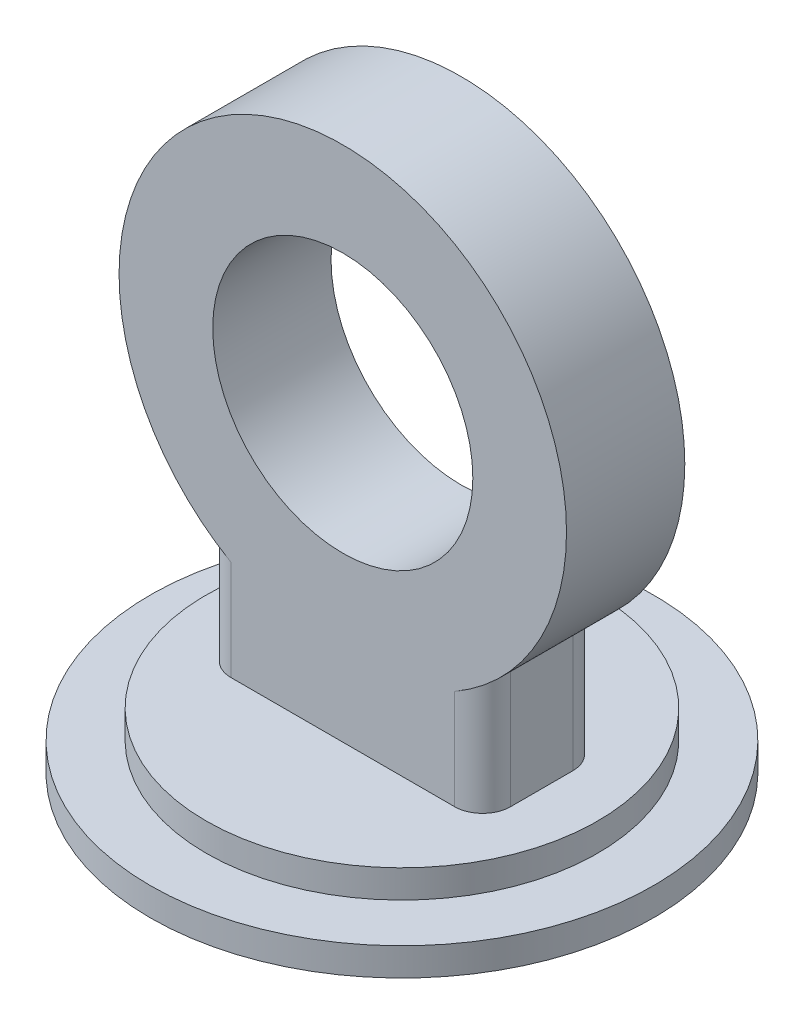
ISO-10303-21;
HEADER;
FILE_DESCRIPTION(('STEP AP214'),'2;1');
FILE_NAME('part.step','',(''),(''),'','','');
FILE_SCHEMA(('AUTOMOTIVE_DESIGN { 1 0 10303 214 1 1 1 1 }'));
ENDSEC;
DATA;
#1=APPLICATION_CONTEXT('core data for automotive mechanical design processes');
#2=APPLICATION_PROTOCOL_DEFINITION('international standard','automotive_design',2000,#1);
#3=PRODUCT_CONTEXT('',#1,'mechanical');
#4=PRODUCT('Part','Part','',(#3));
#5=PRODUCT_RELATED_PRODUCT_CATEGORY('part','',(#4));
#6=PRODUCT_DEFINITION_FORMATION('','',#4);
#7=PRODUCT_DEFINITION_CONTEXT('part definition',#1,'design');
#8=PRODUCT_DEFINITION('design','',#6,#7);
#9=PRODUCT_DEFINITION_SHAPE('','',#8);
#10=(LENGTH_UNIT() NAMED_UNIT(*) SI_UNIT(.MILLI.,.METRE.));
#11=(NAMED_UNIT(*) PLANE_ANGLE_UNIT() SI_UNIT($,.RADIAN.));
#12=(NAMED_UNIT(*) SI_UNIT($,.STERADIAN.) SOLID_ANGLE_UNIT());
#13=UNCERTAINTY_MEASURE_WITH_UNIT(LENGTH_MEASURE(1.E-05),#10,'distance_accuracy_value','');
#14=(GEOMETRIC_REPRESENTATION_CONTEXT(3) GLOBAL_UNCERTAINTY_ASSIGNED_CONTEXT((#13)) GLOBAL_UNIT_ASSIGNED_CONTEXT((#10,
#11,#12)) REPRESENTATION_CONTEXT('',''));
#15=CARTESIAN_POINT('',(0.,0.,0.));
#16=DIRECTION('',(0.,0.,1.));
#17=DIRECTION('',(1.,0.,0.));
#18=AXIS2_PLACEMENT_3D('',#15,#16,#17);
#19=CARTESIAN_POINT('',(0.,10.,0.));
#20=DIRECTION('',(0.,-1.,0.));
#21=DIRECTION('',(0.,0.,-1.));
#22=AXIS2_PLACEMENT_3D('',#19,#20,#21);
#23=CYLINDRICAL_SURFACE('',#22,90.);
#24=CARTESIAN_POINT('',(0.,10.,0.));
#25=DIRECTION('',(0.,1.,0.));
#26=DIRECTION('',(0.,0.,1.));
#27=AXIS2_PLACEMENT_3D('',#24,#25,#26);
#28=CIRCLE('',#27,90.);
#29=CARTESIAN_POINT('',(0.,10.,90.));
#30=VERTEX_POINT('',#29);
#31=EDGE_CURVE('E156',#30,#30,#28,.T.);
#32=ORIENTED_EDGE('',*,*,#31,.F.);
#33=EDGE_LOOP('',(#32));
#34=FACE_BOUND('',#33,.T.);
#35=CARTESIAN_POINT('',(0.,0.,0.));
#36=DIRECTION('',(0.,1.,0.));
#37=DIRECTION('',(0.,0.,1.));
#38=AXIS2_PLACEMENT_3D('',#35,#36,#37);
#39=CIRCLE('',#38,90.);
#40=CARTESIAN_POINT('',(0.,0.,90.));
#41=VERTEX_POINT('',#40);
#42=EDGE_CURVE('E152',#41,#41,#39,.T.);
#43=ORIENTED_EDGE('',*,*,#42,.T.);
#44=EDGE_LOOP('',(#43));
#45=FACE_BOUND('',#44,.T.);
#46=ADVANCED_FACE('F38',(#34,#45),#23,.T.);
#47=CARTESIAN_POINT('',(0.,10.,0.));
#48=DIRECTION('',(0.,1.,0.));
#49=DIRECTION('',(0.,0.,1.));
#50=AXIS2_PLACEMENT_3D('',#47,#48,#49);
#51=PLANE('',#50);
#52=CARTESIAN_POINT('',(0.,10.,0.));
#53=DIRECTION('',(0.,1.,0.));
#54=DIRECTION('',(0.,0.,1.));
#55=AXIS2_PLACEMENT_3D('',#52,#53,#54);
#56=CIRCLE('',#55,70.);
#57=CARTESIAN_POINT('',(0.,10.,70.));
#58=VERTEX_POINT('',#57);
#59=EDGE_CURVE('E153',#58,#58,#56,.T.);
#60=ORIENTED_EDGE('',*,*,#59,.F.);
#61=EDGE_LOOP('',(#60));
#62=FACE_BOUND('',#61,.T.);
#63=ORIENTED_EDGE('',*,*,#31,.T.);
#64=EDGE_LOOP('',(#63));
#65=FACE_BOUND('',#64,.T.);
#66=ADVANCED_FACE('F224',(#62,#65),#51,.T.);
#67=CARTESIAN_POINT('',(0.,0.,0.));
#68=DIRECTION('',(0.,1.,0.));
#69=DIRECTION('',(0.,0.,1.));
#70=AXIS2_PLACEMENT_3D('',#67,#68,#69);
#71=PLANE('',#70);
#72=CARTESIAN_POINT('',(0.,0.,0.));
#73=DIRECTION('',(0.,-1.,0.));
#74=DIRECTION('',(0.,0.,-1.));
#75=AXIS2_PLACEMENT_3D('',#72,#73,#74);
#76=CIRCLE('',#75,46.5);
#77=CARTESIAN_POINT('',(0.,0.,-46.5));
#78=VERTEX_POINT('',#77);
#79=EDGE_CURVE('E276',#78,#78,#76,.T.);
#80=ORIENTED_EDGE('',*,*,#79,.F.);
#81=EDGE_LOOP('',(#80));
#82=FACE_BOUND('',#81,.T.);
#83=ORIENTED_EDGE('',*,*,#42,.F.);
#84=EDGE_LOOP('',(#83));
#85=FACE_BOUND('',#84,.T.);
#86=ADVANCED_FACE('F229',(#82,#85),#71,.F.);
#87=CARTESIAN_POINT('',(0.,20.,0.));
#88=DIRECTION('',(0.,-1.,0.));
#89=DIRECTION('',(0.,0.,-1.));
#90=AXIS2_PLACEMENT_3D('',#87,#88,#89);
#91=CYLINDRICAL_SURFACE('',#90,70.);
#92=CARTESIAN_POINT('',(0.,20.,0.));
#93=DIRECTION('',(0.,1.,0.));
#94=DIRECTION('',(0.,0.,1.));
#95=AXIS2_PLACEMENT_3D('',#92,#93,#94);
#96=CIRCLE('',#95,70.);
#97=CARTESIAN_POINT('',(0.,20.,70.));
#98=VERTEX_POINT('',#97);
#99=EDGE_CURVE('E138',#98,#98,#96,.T.);
#100=ORIENTED_EDGE('',*,*,#99,.F.);
#101=EDGE_LOOP('',(#100));
#102=FACE_BOUND('',#101,.T.);
#103=ORIENTED_EDGE('',*,*,#59,.T.);
#104=EDGE_LOOP('',(#103));
#105=FACE_BOUND('',#104,.T.);
#106=ADVANCED_FACE('F237',(#102,#105),#91,.T.);
#107=CARTESIAN_POINT('',(0.,20.,0.));
#108=DIRECTION('',(0.,1.,0.));
#109=DIRECTION('',(0.,0.,1.));
#110=AXIS2_PLACEMENT_3D('',#107,#108,#109);
#111=PLANE('',#110);
#112=DIRECTION('',(0.,0.,-1.));
#113=VECTOR('',#112,1.);
#114=CARTESIAN_POINT('',(50.,20.,-21.15));
#115=LINE('',#114,#113);
#116=CARTESIAN_POINT('',(50.,20.,11.15));
#117=VERTEX_POINT('',#116);
#118=CARTESIAN_POINT('',(50.,20.,-11.15));
#119=VERTEX_POINT('',#118);
#120=EDGE_CURVE('E135',#117,#119,#115,.T.);
#121=ORIENTED_EDGE('',*,*,#120,.F.);
#122=CARTESIAN_POINT('',(40.,20.,11.15));
#123=DIRECTION('',(0.,1.,0.));
#124=DIRECTION('',(0.,0.,1.));
#125=AXIS2_PLACEMENT_3D('',#122,#123,#124);
#126=CIRCLE('',#125,10.);
#127=CARTESIAN_POINT('',(40.,20.,21.15));
#128=VERTEX_POINT('',#127);
#129=EDGE_CURVE('E66',#117,#128,#126,.F.);
#130=ORIENTED_EDGE('',*,*,#129,.T.);
#131=DIRECTION('',(1.,0.,0.));
#132=VECTOR('',#131,1.);
#133=CARTESIAN_POINT('',(-50.,20.,21.15));
#134=LINE('',#133,#132);
#135=CARTESIAN_POINT('',(-40.,20.,21.15));
#136=VERTEX_POINT('',#135);
#137=EDGE_CURVE('E127',#136,#128,#134,.T.);
#138=ORIENTED_EDGE('',*,*,#137,.F.);
#139=CARTESIAN_POINT('',(-40.,20.,11.15));
#140=DIRECTION('',(0.,1.,0.));
#141=DIRECTION('',(0.,0.,1.));
#142=AXIS2_PLACEMENT_3D('',#139,#140,#141);
#143=CIRCLE('',#142,10.);
#144=CARTESIAN_POINT('',(-50.,20.,11.15));
#145=VERTEX_POINT('',#144);
#146=EDGE_CURVE('E110',#136,#145,#143,.F.);
#147=ORIENTED_EDGE('',*,*,#146,.T.);
#148=DIRECTION('',(0.,0.,1.));
#149=VECTOR('',#148,1.);
#150=CARTESIAN_POINT('',(-50.,20.,-21.15));
#151=LINE('',#150,#149);
#152=CARTESIAN_POINT('',(-50.,20.,-11.15));
#153=VERTEX_POINT('',#152);
#154=EDGE_CURVE('E136',#153,#145,#151,.T.);
#155=ORIENTED_EDGE('',*,*,#154,.F.);
#156=CARTESIAN_POINT('',(-40.,20.,-11.15));
#157=DIRECTION('',(0.,1.,0.));
#158=DIRECTION('',(0.,0.,1.));
#159=AXIS2_PLACEMENT_3D('',#156,#157,#158);
#160=CIRCLE('',#159,10.);
#161=CARTESIAN_POINT('',(-40.,20.,-21.15));
#162=VERTEX_POINT('',#161);
#163=EDGE_CURVE('E180',#153,#162,#160,.F.);
#164=ORIENTED_EDGE('',*,*,#163,.T.);
#165=DIRECTION('',(-1.,0.,0.));
#166=VECTOR('',#165,1.);
#167=CARTESIAN_POINT('',(-50.,20.,-21.15));
#168=LINE('',#167,#166);
#169=CARTESIAN_POINT('',(40.,20.,-21.15));
#170=VERTEX_POINT('',#169);
#171=EDGE_CURVE('E140',#170,#162,#168,.T.);
#172=ORIENTED_EDGE('',*,*,#171,.F.);
#173=CARTESIAN_POINT('',(40.,20.,-11.15));
#174=DIRECTION('',(0.,1.,0.));
#175=DIRECTION('',(0.,0.,1.));
#176=AXIS2_PLACEMENT_3D('',#173,#174,#175);
#177=CIRCLE('',#176,10.);
#178=EDGE_CURVE('E52',#170,#119,#177,.F.);
#179=ORIENTED_EDGE('',*,*,#178,.T.);
#180=EDGE_LOOP('',(#121,#130,#138,#147,#155,#164,#172,#179));
#181=FACE_BOUND('',#180,.T.);
#182=ORIENTED_EDGE('',*,*,#99,.T.);
#183=EDGE_LOOP('',(#182));
#184=FACE_BOUND('',#183,.T.);
#185=ADVANCED_FACE('F133',(#181,#184),#111,.T.);
#186=CARTESIAN_POINT('',(-50.,205.002,-21.15));
#187=DIRECTION('',(0.,0.,1.));
#188=DIRECTION('',(1.,0.,0.));
#189=AXIS2_PLACEMENT_3D('',#186,#187,#188);
#190=PLANE('',#189);
#191=ORIENTED_EDGE('',*,*,#171,.T.);
#192=DIRECTION('',(0.,-1.,0.));
#193=VECTOR('',#192,1.);
#194=CARTESIAN_POINT('',(-40.,205.002,-21.15));
#195=LINE('',#194,#193);
#196=CARTESIAN_POINT('',(-40.,55.7179676972449,-21.15));
#197=VERTEX_POINT('',#196);
#198=EDGE_CURVE('E168',#162,#197,#195,.F.);
#199=ORIENTED_EDGE('',*,*,#198,.T.);
#200=CARTESIAN_POINT('',(0.,125.,-21.15));
#201=DIRECTION('',(0.,0.,1.));
#202=DIRECTION('',(1.,0.,0.));
#203=AXIS2_PLACEMENT_3D('',#200,#201,#202);
#204=CIRCLE('',#203,80.0000000000001);
#205=CARTESIAN_POINT('',(40.,55.7179676972448,-21.15));
#206=VERTEX_POINT('',#205);
#207=EDGE_CURVE('E273',#206,#197,#204,.T.);
#208=ORIENTED_EDGE('',*,*,#207,.F.);
#209=DIRECTION('',(0.,-1.,0.));
#210=VECTOR('',#209,1.);
#211=CARTESIAN_POINT('',(40.,205.002,-21.15));
#212=LINE('',#211,#210);
#213=EDGE_CURVE('E165',#206,#170,#212,.T.);
#214=ORIENTED_EDGE('',*,*,#213,.T.);
#215=EDGE_LOOP('',(#191,#199,#208,#214));
#216=FACE_BOUND('',#215,.T.);
#217=CARTESIAN_POINT('',(0.,125.,-21.15));
#218=DIRECTION('',(0.,0.,1.));
#219=DIRECTION('',(1.,0.,0.));
#220=AXIS2_PLACEMENT_3D('',#217,#218,#219);
#221=CIRCLE('',#220,46.5);
#222=CARTESIAN_POINT('',(46.5,125.,-21.15));
#223=VERTEX_POINT('',#222);
#224=EDGE_CURVE('E267',#223,#223,#221,.T.);
#225=ORIENTED_EDGE('',*,*,#224,.T.);
#226=EDGE_LOOP('',(#225));
#227=FACE_BOUND('',#226,.T.);
#228=ADVANCED_FACE('F250',(#216,#227),#190,.F.);
#229=CARTESIAN_POINT('',(50.,205.002,-21.15));
#230=DIRECTION('',(-1.,0.,0.));
#231=DIRECTION('',(0.,0.,1.));
#232=AXIS2_PLACEMENT_3D('',#229,#230,#231);
#233=PLANE('',#232);
#234=DIRECTION('',(0.,0.,-1.));
#235=VECTOR('',#234,1.);
#236=CARTESIAN_POINT('',(50.,62.5500200160159,21.15));
#237=LINE('',#236,#235);
#238=CARTESIAN_POINT('',(50.,62.5500200160159,11.15));
#239=VERTEX_POINT('',#238);
#240=CARTESIAN_POINT('',(50.,62.5500200160159,-11.15));
#241=VERTEX_POINT('',#240);
#242=EDGE_CURVE('E144',#239,#241,#237,.T.);
#243=ORIENTED_EDGE('',*,*,#242,.F.);
#244=DIRECTION('',(0.,-1.,0.));
#245=VECTOR('',#244,1.);
#246=CARTESIAN_POINT('',(50.,205.002,11.15));
#247=LINE('',#246,#245);
#248=EDGE_CURVE('E120',#239,#117,#247,.T.);
#249=ORIENTED_EDGE('',*,*,#248,.T.);
#250=ORIENTED_EDGE('',*,*,#120,.T.);
#251=DIRECTION('',(0.,-1.,0.));
#252=VECTOR('',#251,1.);
#253=CARTESIAN_POINT('',(50.,205.002,-11.15));
#254=LINE('',#253,#252);
#255=EDGE_CURVE('E171',#119,#241,#254,.F.);
#256=ORIENTED_EDGE('',*,*,#255,.T.);
#257=EDGE_LOOP('',(#243,#249,#250,#256));
#258=FACE_BOUND('',#257,.T.);
#259=ADVANCED_FACE('F215',(#258),#233,.F.);
#260=CARTESIAN_POINT('',(-50.,205.002,-21.15));
#261=DIRECTION('',(1.,0.,0.));
#262=DIRECTION('',(0.,0.,-1.));
#263=AXIS2_PLACEMENT_3D('',#260,#261,#262);
#264=PLANE('',#263);
#265=ORIENTED_EDGE('',*,*,#154,.T.);
#266=DIRECTION('',(0.,-1.,0.));
#267=VECTOR('',#266,1.);
#268=CARTESIAN_POINT('',(-50.,205.002,11.15));
#269=LINE('',#268,#267);
#270=CARTESIAN_POINT('',(-50.,62.5500200160159,11.15));
#271=VERTEX_POINT('',#270);
#272=EDGE_CURVE('E115',#145,#271,#269,.F.);
#273=ORIENTED_EDGE('',*,*,#272,.T.);
#274=DIRECTION('',(0.,0.,-1.));
#275=VECTOR('',#274,1.);
#276=CARTESIAN_POINT('',(-50.,62.5500200160159,21.15));
#277=LINE('',#276,#275);
#278=CARTESIAN_POINT('',(-50.,62.5500200160159,-11.15));
#279=VERTEX_POINT('',#278);
#280=EDGE_CURVE('E147',#279,#271,#277,.F.);
#281=ORIENTED_EDGE('',*,*,#280,.F.);
#282=DIRECTION('',(0.,-1.,0.));
#283=VECTOR('',#282,1.);
#284=CARTESIAN_POINT('',(-50.,205.002,-11.15));
#285=LINE('',#284,#283);
#286=EDGE_CURVE('E130',#279,#153,#285,.T.);
#287=ORIENTED_EDGE('',*,*,#286,.T.);
#288=EDGE_LOOP('',(#265,#273,#281,#287));
#289=FACE_BOUND('',#288,.T.);
#290=ADVANCED_FACE('F253',(#289),#264,.F.);
#291=CARTESIAN_POINT('',(-50.,205.002,21.15));
#292=DIRECTION('',(0.,0.,-1.));
#293=DIRECTION('',(-1.,0.,0.));
#294=AXIS2_PLACEMENT_3D('',#291,#292,#293);
#295=PLANE('',#294);
#296=CARTESIAN_POINT('',(0.,125.,21.15));
#297=DIRECTION('',(0.,0.,1.));
#298=DIRECTION('',(1.,0.,0.));
#299=AXIS2_PLACEMENT_3D('',#296,#297,#298);
#300=CIRCLE('',#299,80.0000000000001);
#301=CARTESIAN_POINT('',(40.,55.7179676972448,21.15));
#302=VERTEX_POINT('',#301);
#303=CARTESIAN_POINT('',(-40.,55.7179676972449,21.15));
#304=VERTEX_POINT('',#303);
#305=EDGE_CURVE('E128',#302,#304,#300,.T.);
#306=ORIENTED_EDGE('',*,*,#305,.T.);
#307=DIRECTION('',(0.,-1.,0.));
#308=VECTOR('',#307,1.);
#309=CARTESIAN_POINT('',(-40.,205.002,21.15));
#310=LINE('',#309,#308);
#311=EDGE_CURVE('E114',#304,#136,#310,.T.);
#312=ORIENTED_EDGE('',*,*,#311,.T.);
#313=ORIENTED_EDGE('',*,*,#137,.T.);
#314=DIRECTION('',(0.,-1.,0.));
#315=VECTOR('',#314,1.);
#316=CARTESIAN_POINT('',(40.,205.002,21.15));
#317=LINE('',#316,#315);
#318=EDGE_CURVE('E131',#128,#302,#317,.F.);
#319=ORIENTED_EDGE('',*,*,#318,.T.);
#320=EDGE_LOOP('',(#306,#312,#313,#319));
#321=FACE_BOUND('',#320,.T.);
#322=CARTESIAN_POINT('',(0.,125.,21.15));
#323=DIRECTION('',(0.,0.,1.));
#324=DIRECTION('',(1.,0.,0.));
#325=AXIS2_PLACEMENT_3D('',#322,#323,#324);
#326=CIRCLE('',#325,46.5);
#327=CARTESIAN_POINT('',(46.5,125.,21.15));
#328=VERTEX_POINT('',#327);
#329=EDGE_CURVE('E269',#328,#328,#326,.T.);
#330=ORIENTED_EDGE('',*,*,#329,.F.);
#331=EDGE_LOOP('',(#330));
#332=FACE_BOUND('',#331,.T.);
#333=ADVANCED_FACE('F124',(#321,#332),#295,.F.);
#334=CARTESIAN_POINT('',(0.,125.,21.15));
#335=DIRECTION('',(0.,0.,-1.));
#336=DIRECTION('',(-1.,0.,0.));
#337=AXIS2_PLACEMENT_3D('',#334,#335,#336);
#338=CYLINDRICAL_SURFACE('',#337,80.0000000000001);
#339=ORIENTED_EDGE('',*,*,#305,.F.);
#340=CARTESIAN_POINT('',(40.,55.7179676972448,21.15));
#341=CARTESIAN_POINT('',(40.3689976732706,55.9309609735423,21.1499875713245));
#342=CARTESIAN_POINT('',(40.7361799112235,56.1469298162725,21.1295788378013));
#343=CARTESIAN_POINT('',(41.4638562418589,56.5827017260331,21.0490489046526));
#344=CARTESIAN_POINT('',(41.8243504837945,56.8025047072857,20.9889285923522));
#345=CARTESIAN_POINT('',(42.5370031251916,57.2447019270337,20.8297444370872));
#346=CARTESIAN_POINT('',(42.8891233479978,57.467102942614,20.730528994944));
#347=CARTESIAN_POINT('',(43.580716120754,57.9113279747078,20.494089290935));
#348=CARTESIAN_POINT('',(43.920189903552,58.1331520454936,20.3568687450847));
#349=CARTESIAN_POINT('',(44.5482417283014,58.5501633843106,20.0618286198056));
#350=CARTESIAN_POINT('',(44.8383839574883,58.7456659000797,19.9077727057748));
#351=CARTESIAN_POINT('',(45.4042953963135,59.1321980929339,19.5703389382688));
#352=CARTESIAN_POINT('',(45.6800646138335,59.3232277724717,19.3869611008729));
#353=CARTESIAN_POINT('',(46.2144375841633,59.6981462380428,18.9916214803814));
#354=CARTESIAN_POINT('',(46.4730737941562,59.8820482356008,18.779716193622));
#355=CARTESIAN_POINT('',(46.9712114770613,60.240449670333,18.3274170057208));
#356=CARTESIAN_POINT('',(47.2107190781998,60.4149521129596,18.0870322903122));
#357=CARTESIAN_POINT('',(47.6083833652792,60.7078071565296,17.6443515508559));
#358=CARTESIAN_POINT('',(47.7715189137748,60.8289770407847,17.4483655301684));
#359=CARTESIAN_POINT('',(48.084414752266,61.063099781067,17.0413583216135));
#360=CARTESIAN_POINT('',(48.2341764444517,61.1760534982925,16.8303387141319));
#361=CARTESIAN_POINT('',(48.5187437626288,61.3921120502551,16.3939308076684));
#362=CARTESIAN_POINT('',(48.6535613244899,61.4952247357348,16.1685542055175));
#363=CARTESIAN_POINT('',(48.9067734049082,61.6900242000072,15.7040444073238));
#364=CARTESIAN_POINT('',(49.0251706673479,61.7817128875243,15.4649135191354));
#365=CARTESIAN_POINT('',(49.2264412557213,61.9383550673278,15.0131357918325));
#366=CARTESIAN_POINT('',(49.3119690189232,62.0052407178855,14.8023387729469));
#367=CARTESIAN_POINT('',(49.4692284664571,62.1286597025826,14.3727336646377));
#368=CARTESIAN_POINT('',(49.5409626385788,62.1851949034239,14.1539270283057));
#369=CARTESIAN_POINT('',(49.669588045711,62.2868534965442,13.7097716119859));
#370=CARTESIAN_POINT('',(49.7265020985098,62.3319944286788,13.4844334898933));
#371=CARTESIAN_POINT('',(49.8247642232154,62.4100901577229,13.0284022798576));
#372=CARTESIAN_POINT('',(49.8661183817276,62.4430497195618,12.7977113233663));
#373=CARTESIAN_POINT('',(49.9327139796027,62.4961928085632,12.3318182146469));
#374=CARTESIAN_POINT('',(49.9579081777892,62.5163388760028,12.0966048877775));
#375=CARTESIAN_POINT('',(49.9831417566219,62.536525555071,11.7423841510729));
#376=CARTESIAN_POINT('',(49.989460001101,62.5415823825934,11.6240619522908));
#377=CARTESIAN_POINT('',(49.9978898869952,62.5483305052858,11.3871654733551));
#378=CARTESIAN_POINT('',(50.0000012928244,62.5500216119732,11.268591179456));
#379=CARTESIAN_POINT('',(50.,62.5500200160159,11.15));
#380=B_SPLINE_CURVE_WITH_KNOTS('',3,(#340,#341,#342,#343,#344,#345,#346,#347,#348,#349,#350,
#351,#352,#353,#354,#355,#356,#357,#358,#359,#360,#361,#362,#363,#364,#365,#366,#367,#368,#369,
#370,#371,#372,#373,#374,#375,#376,#377,#378,#379),.UNSPECIFIED.,.F.,.F.,(4,2,2,2,2,2,2,2,2,2,2,
2,2,2,2,2,2,2,2,4),(0.,1.27755514635886,2.55508174768403,3.83761174955476,5.12001639405505,
6.26549830173693,7.41097958127448,8.55422481297942,9.69710230200322,10.5433180224158,
11.3894449164058,12.2348910643361,13.080195764955,13.790836170925,14.5013482864783,
15.2107599063477,15.9198937345566,16.6310912710983,16.9867806723675,17.3424899919273),.UNSPECIFIED.);
#381=EDGE_CURVE('E205',#302,#239,#380,.T.);
#382=ORIENTED_EDGE('',*,*,#381,.T.);
#383=ORIENTED_EDGE('',*,*,#242,.T.);
#384=CARTESIAN_POINT('',(50.,62.5500200160159,-11.15));
#385=CARTESIAN_POINT('',(50.0000013652644,62.5500217034721,-11.2703151215902));
#386=CARTESIAN_POINT('',(49.9978280749982,62.5482810121775,-11.3906125788915));
#387=CARTESIAN_POINT('',(49.9891515660914,62.5413355032819,-11.6309446446446));
#388=CARTESIAN_POINT('',(49.9826485830042,62.5361308741336,-11.7509792670394));
#389=CARTESIAN_POINT('',(49.956689265006,62.5153641018757,-12.1101534403694));
#390=CARTESIAN_POINT('',(49.930782488159,62.4946489981695,-12.3485788481359));
#391=CARTESIAN_POINT('',(49.8624636844848,62.440135939025,-12.8197670540838));
#392=CARTESIAN_POINT('',(49.8201676843271,62.4064299605938,-13.052557699742));
#393=CARTESIAN_POINT('',(49.719760146887,62.3266439675881,-13.5125589871084));
#394=CARTESIAN_POINT('',(49.6616468141535,62.2805625482652,-13.739768992155));
#395=CARTESIAN_POINT('',(49.5306625974619,62.1770710820111,-14.1865317266476));
#396=CARTESIAN_POINT('',(49.4578314740758,62.1196915677208,-14.4061032571495));
#397=CARTESIAN_POINT('',(49.2982666521648,61.9945146234135,-14.8371512460061));
#398=CARTESIAN_POINT('',(49.211527450681,61.926713070187,-15.0486244589281));
#399=CARTESIAN_POINT('',(49.0250730618641,61.7816786587151,-15.4627336380951));
#400=CARTESIAN_POINT('',(48.9253427726175,61.7044348305273,-15.6653589469639));
#401=CARTESIAN_POINT('',(48.7139939920506,61.5416306498692,-16.0608703386619));
#402=CARTESIAN_POINT('',(48.6023708906998,61.4560670735322,-16.2537526017586));
#403=CARTESIAN_POINT('',(48.2302836194686,61.1725601120216,-16.8503849542447));
#404=CARTESIAN_POINT('',(47.9492694571238,60.9608803535643,-17.2351184658457));
#405=CARTESIAN_POINT('',(47.3447747732413,60.5126821522838,-17.9525582586242));
#406=CARTESIAN_POINT('',(47.0212838355728,60.2761576198944,-18.2852517345827));
#407=CARTESIAN_POINT('',(46.2666935921726,59.7339927632726,-18.9626263789818));
#408=CARTESIAN_POINT('',(45.8273211666556,59.4243311752738,-19.2948925307286));
#409=CARTESIAN_POINT('',(44.9072517357115,58.7908545235438,-19.8802058386924));
#410=CARTESIAN_POINT('',(44.4265106361112,58.4670245432265,-20.133167098135));
#411=CARTESIAN_POINT('',(43.6212013424059,57.9378786433637,-20.4773708412194));
#412=CARTESIAN_POINT('',(43.3061454267921,57.7339464482362,-20.5936194064065));
#413=CARTESIAN_POINT('',(42.6658554767543,57.3260110862074,-20.7939473637955));
#414=CARTESIAN_POINT('',(42.3406198143273,57.1220079131672,-20.8780215817617));
#415=CARTESIAN_POINT('',(41.6824644858958,56.715878027787,-21.0131701311202));
#416=CARTESIAN_POINT('',(41.3495490165476,56.5137503714544,-21.0642620631634));
#417=CARTESIAN_POINT('',(40.6782672388851,56.1128993735103,-21.1326714011044));
#418=CARTESIAN_POINT('',(40.3399010910669,55.9141759320154,-21.1499897996439));
#419=CARTESIAN_POINT('',(40.,55.7179676972448,-21.15));
#420=B_SPLINE_CURVE_WITH_KNOTS('',3,(#384,#385,#386,#387,#388,#389,#390,#391,#392,#393,#394,
#395,#396,#397,#398,#399,#400,#401,#402,#403,#404,#405,#406,#407,#408,#409,#410,#411,#412,#413,
#414,#415,#416,#417,#418,#419),.UNSPECIFIED.,.F.,.F.,(4,2,2,2,2,2,2,2,2,2,2,2,2,2,2,2,2,4),(0.,
0.360878251737519,0.721736871785234,1.44280994380279,2.15886882938205,2.87500902988399,
3.58923981540079,4.30375389854963,5.01910613073302,5.73473667195846,7.29267206060998,
8.85099020125018,10.7397180470035,12.630484601331,13.8078623988071,14.9854294611264,
16.1623676065333,17.3392711599006),.UNSPECIFIED.);
#421=EDGE_CURVE('E11',#241,#206,#420,.T.);
#422=ORIENTED_EDGE('',*,*,#421,.T.);
#423=ORIENTED_EDGE('',*,*,#207,.T.);
#424=CARTESIAN_POINT('',(-40.,55.7179676972449,-21.15));
#425=CARTESIAN_POINT('',(-40.3689976732706,55.9309609735423,-21.1499875713245));
#426=CARTESIAN_POINT('',(-40.7361799112236,56.1469298162725,-21.1295788378013));
#427=CARTESIAN_POINT('',(-41.4638562418589,56.5827017260331,-21.0490489046526));
#428=CARTESIAN_POINT('',(-41.8243504837945,56.8025047072857,-20.9889285923522));
#429=CARTESIAN_POINT('',(-42.5370031251916,57.2447019270337,-20.8297444370872));
#430=CARTESIAN_POINT('',(-42.8891233479978,57.4671029426141,-20.730528994944));
#431=CARTESIAN_POINT('',(-43.580716120754,57.9113279747078,-20.494089290935));
#432=CARTESIAN_POINT('',(-43.9201899035521,58.1331520454936,-20.3568687450847));
#433=CARTESIAN_POINT('',(-44.5482417283014,58.5501633843106,-20.0618286198056));
#434=CARTESIAN_POINT('',(-44.8383839574883,58.7456659000798,-19.9077727057748));
#435=CARTESIAN_POINT('',(-45.4042953963135,59.132198092934,-19.5703389382688));
#436=CARTESIAN_POINT('',(-45.6800646138335,59.3232277724718,-19.3869611008729));
#437=CARTESIAN_POINT('',(-46.2144375841634,59.6981462380428,-18.9916214803814));
#438=CARTESIAN_POINT('',(-46.4730737941562,59.8820482356008,-18.779716193622));
#439=CARTESIAN_POINT('',(-46.9712114770613,60.240449670333,-18.3274170057209));
#440=CARTESIAN_POINT('',(-47.2107190781998,60.4149521129596,-18.0870322903123));
#441=CARTESIAN_POINT('',(-47.6083833652792,60.7078071565296,-17.6443515508559));
#442=CARTESIAN_POINT('',(-47.7715189137749,60.8289770407847,-17.4483655301685));
#443=CARTESIAN_POINT('',(-48.084414752266,61.063099781067,-17.0413583216135));
#444=CARTESIAN_POINT('',(-48.2341764444517,61.1760534982925,-16.8303387141319));
#445=CARTESIAN_POINT('',(-48.5187437626289,61.3921120502552,-16.3939308076684));
#446=CARTESIAN_POINT('',(-48.6535613244899,61.4952247357349,-16.1685542055175));
#447=CARTESIAN_POINT('',(-48.9067734049082,61.6900242000073,-15.7040444073238));
#448=CARTESIAN_POINT('',(-49.025170667348,61.7817128875243,-15.4649135191354));
#449=CARTESIAN_POINT('',(-49.2264412557213,61.9383550673278,-15.0131357918325));
#450=CARTESIAN_POINT('',(-49.3119690189232,62.0052407178855,-14.8023387729469));
#451=CARTESIAN_POINT('',(-49.4692284664571,62.1286597025826,-14.3727336646377));
#452=CARTESIAN_POINT('',(-49.5409626385788,62.1851949034239,-14.1539270283057));
#453=CARTESIAN_POINT('',(-49.669588045711,62.2868534965442,-13.7097716119859));
#454=CARTESIAN_POINT('',(-49.7265020985099,62.3319944286788,-13.4844334898933));
#455=CARTESIAN_POINT('',(-49.8247642232154,62.4100901577229,-13.0284022798577));
#456=CARTESIAN_POINT('',(-49.8661183817276,62.4430497195618,-12.7977113233663));
#457=CARTESIAN_POINT('',(-49.9327139796027,62.4961928085632,-12.3318182146469));
#458=CARTESIAN_POINT('',(-49.9579081777892,62.5163388760029,-12.0966048877775));
#459=CARTESIAN_POINT('',(-49.9831417566219,62.536525555071,-11.7423841510729));
#460=CARTESIAN_POINT('',(-49.989460001101,62.5415823825934,-11.6240619522909));
#461=CARTESIAN_POINT('',(-49.9978898869952,62.5483305052858,-11.3871654733551));
#462=CARTESIAN_POINT('',(-50.0000012928244,62.5500216119732,-11.2685911794561));
#463=CARTESIAN_POINT('',(-50.,62.5500200160159,-11.15));
#464=B_SPLINE_CURVE_WITH_KNOTS('',3,(#424,#425,#426,#427,#428,#429,#430,#431,#432,#433,#434,
#435,#436,#437,#438,#439,#440,#441,#442,#443,#444,#445,#446,#447,#448,#449,#450,#451,#452,#453,
#454,#455,#456,#457,#458,#459,#460,#461,#462,#463),.UNSPECIFIED.,.F.,.F.,(4,2,2,2,2,2,2,2,2,2,2,
2,2,2,2,2,2,2,2,4),(0.,1.27755514635886,2.55508174768403,3.83761174955475,5.12001639405505,
6.26549830173693,7.41097958127447,8.55422481297942,9.69710230200322,10.5433180224158,
11.3894449164058,12.2348910643361,13.080195764955,13.7908361709251,14.5013482864783,
15.2107599063478,15.9198937345566,16.6310912710983,16.9867806723675,17.3424899919273),.UNSPECIFIED.);
#465=EDGE_CURVE('E198',#197,#279,#464,.T.);
#466=ORIENTED_EDGE('',*,*,#465,.T.);
#467=ORIENTED_EDGE('',*,*,#280,.T.);
#468=CARTESIAN_POINT('',(-50.,62.5500200160159,11.15));
#469=CARTESIAN_POINT('',(-50.0000013652644,62.5500217034721,11.2703151215902));
#470=CARTESIAN_POINT('',(-49.9978280749983,62.5482810121775,11.3906125788915));
#471=CARTESIAN_POINT('',(-49.9891515660914,62.5413355032819,11.6309446446446));
#472=CARTESIAN_POINT('',(-49.9826485830042,62.5361308741336,11.7509792670394));
#473=CARTESIAN_POINT('',(-49.9566892650061,62.5153641018758,12.1101534403694));
#474=CARTESIAN_POINT('',(-49.930782488159,62.4946489981696,12.3485788481359));
#475=CARTESIAN_POINT('',(-49.8624636844848,62.4401359390251,12.8197670540838));
#476=CARTESIAN_POINT('',(-49.8201676843271,62.4064299605938,13.052557699742));
#477=CARTESIAN_POINT('',(-49.719760146887,62.3266439675881,13.5125589871084));
#478=CARTESIAN_POINT('',(-49.6616468141535,62.2805625482652,13.739768992155));
#479=CARTESIAN_POINT('',(-49.5306625974619,62.1770710820111,14.1865317266476));
#480=CARTESIAN_POINT('',(-49.4578314740759,62.1196915677208,14.4061032571495));
#481=CARTESIAN_POINT('',(-49.2982666521648,61.9945146234135,14.837151246006));
#482=CARTESIAN_POINT('',(-49.211527450681,61.926713070187,15.0486244589281));
#483=CARTESIAN_POINT('',(-49.0250730618642,61.7816786587151,15.4627336380951));
#484=CARTESIAN_POINT('',(-48.9253427726175,61.7044348305273,15.6653589469639));
#485=CARTESIAN_POINT('',(-48.7139939920506,61.5416306498692,16.0608703386619));
#486=CARTESIAN_POINT('',(-48.6023708906998,61.4560670735322,16.2537526017586));
#487=CARTESIAN_POINT('',(-48.2302836194686,61.1725601120216,16.8503849542447));
#488=CARTESIAN_POINT('',(-47.9492694571238,60.9608803535644,17.2351184658457));
#489=CARTESIAN_POINT('',(-47.3447747732413,60.5126821522839,17.9525582586242));
#490=CARTESIAN_POINT('',(-47.0212838355729,60.2761576198944,18.2852517345827));
#491=CARTESIAN_POINT('',(-46.2666935921726,59.7339927632727,18.9626263789818));
#492=CARTESIAN_POINT('',(-45.8273211666556,59.4243311752738,19.2948925307286));
#493=CARTESIAN_POINT('',(-44.9072517357116,58.7908545235438,19.8802058386924));
#494=CARTESIAN_POINT('',(-44.4265106361112,58.4670245432266,20.133167098135));
#495=CARTESIAN_POINT('',(-43.6212013424059,57.9378786433637,20.4773708412194));
#496=CARTESIAN_POINT('',(-43.3061454267921,57.7339464482362,20.5936194064065));
#497=CARTESIAN_POINT('',(-42.6658554767543,57.3260110862074,20.7939473637955));
#498=CARTESIAN_POINT('',(-42.3406198143273,57.1220079131672,20.8780215817617));
#499=CARTESIAN_POINT('',(-41.6824644858959,56.715878027787,21.0131701311202));
#500=CARTESIAN_POINT('',(-41.3495490165477,56.5137503714544,21.0642620631634));
#501=CARTESIAN_POINT('',(-40.6782672388851,56.1128993735104,21.1326714011044));
#502=CARTESIAN_POINT('',(-40.3399010910669,55.9141759320155,21.1499897996439));
#503=CARTESIAN_POINT('',(-40.,55.7179676972448,21.15));
#504=B_SPLINE_CURVE_WITH_KNOTS('',3,(#468,#469,#470,#471,#472,#473,#474,#475,#476,#477,#478,
#479,#480,#481,#482,#483,#484,#485,#486,#487,#488,#489,#490,#491,#492,#493,#494,#495,#496,#497,
#498,#499,#500,#501,#502,#503),.UNSPECIFIED.,.F.,.F.,(4,2,2,2,2,2,2,2,2,2,2,2,2,2,2,2,2,4),(0.,
0.360878251737519,0.721736871785235,1.44280994380279,2.15886882938205,2.87500902988399,
3.58923981540079,4.30375389854963,5.01910613073301,5.73473667195846,7.29267206060998,
8.85099020125018,10.7397180470034,12.630484601331,13.8078623988071,14.9854294611264,
16.1623676065333,17.3392711599006),.UNSPECIFIED.);
#505=EDGE_CURVE('E119',#271,#304,#504,.T.);
#506=ORIENTED_EDGE('',*,*,#505,.T.);
#507=EDGE_LOOP('',(#339,#382,#383,#422,#423,#466,#467,#506));
#508=FACE_BOUND('',#507,.T.);
#509=ADVANCED_FACE('F182',(#508),#338,.T.);
#510=CARTESIAN_POINT('',(0.,125.,21.15));
#511=DIRECTION('',(0.,0.,-1.));
#512=DIRECTION('',(-1.,0.,0.));
#513=AXIS2_PLACEMENT_3D('',#510,#511,#512);
#514=CYLINDRICAL_SURFACE('',#513,46.5);
#515=ORIENTED_EDGE('',*,*,#329,.T.);
#516=EDGE_LOOP('',(#515));
#517=FACE_BOUND('',#516,.T.);
#518=ORIENTED_EDGE('',*,*,#224,.F.);
#519=EDGE_LOOP('',(#518));
#520=FACE_BOUND('',#519,.T.);
#521=ADVANCED_FACE('F191',(#517,#520),#514,.F.);
#522=CARTESIAN_POINT('',(-40.,205.002,11.15));
#523=DIRECTION('',(0.,-1.,0.));
#524=DIRECTION('',(0.,0.,-1.));
#525=AXIS2_PLACEMENT_3D('',#522,#523,#524);
#526=CYLINDRICAL_SURFACE('',#525,10.);
#527=ORIENTED_EDGE('',*,*,#505,.F.);
#528=ORIENTED_EDGE('',*,*,#272,.F.);
#529=ORIENTED_EDGE('',*,*,#146,.F.);
#530=ORIENTED_EDGE('',*,*,#311,.F.);
#531=EDGE_LOOP('',(#527,#528,#529,#530));
#532=FACE_BOUND('',#531,.T.);
#533=ADVANCED_FACE('F113',(#532),#526,.T.);
#534=CARTESIAN_POINT('',(-40.,205.002,-11.15));
#535=DIRECTION('',(0.,-1.,0.));
#536=DIRECTION('',(0.,0.,-1.));
#537=AXIS2_PLACEMENT_3D('',#534,#535,#536);
#538=CYLINDRICAL_SURFACE('',#537,10.);
#539=ORIENTED_EDGE('',*,*,#465,.F.);
#540=ORIENTED_EDGE('',*,*,#198,.F.);
#541=ORIENTED_EDGE('',*,*,#163,.F.);
#542=ORIENTED_EDGE('',*,*,#286,.F.);
#543=EDGE_LOOP('',(#539,#540,#541,#542));
#544=FACE_BOUND('',#543,.T.);
#545=ADVANCED_FACE('F190',(#544),#538,.T.);
#546=CARTESIAN_POINT('',(40.,205.002,11.15));
#547=DIRECTION('',(0.,-1.,0.));
#548=DIRECTION('',(0.,0.,-1.));
#549=AXIS2_PLACEMENT_3D('',#546,#547,#548);
#550=CYLINDRICAL_SURFACE('',#549,10.);
#551=ORIENTED_EDGE('',*,*,#381,.F.);
#552=ORIENTED_EDGE('',*,*,#318,.F.);
#553=ORIENTED_EDGE('',*,*,#129,.F.);
#554=ORIENTED_EDGE('',*,*,#248,.F.);
#555=EDGE_LOOP('',(#551,#552,#553,#554));
#556=FACE_BOUND('',#555,.T.);
#557=ADVANCED_FACE('F195',(#556),#550,.T.);
#558=CARTESIAN_POINT('',(40.,205.002,-11.15));
#559=DIRECTION('',(0.,-1.,0.));
#560=DIRECTION('',(0.,0.,-1.));
#561=AXIS2_PLACEMENT_3D('',#558,#559,#560);
#562=CYLINDRICAL_SURFACE('',#561,10.);
#563=ORIENTED_EDGE('',*,*,#421,.F.);
#564=ORIENTED_EDGE('',*,*,#255,.F.);
#565=ORIENTED_EDGE('',*,*,#178,.F.);
#566=ORIENTED_EDGE('',*,*,#213,.F.);
#567=EDGE_LOOP('',(#563,#564,#565,#566));
#568=FACE_BOUND('',#567,.T.);
#569=ADVANCED_FACE('F40',(#568),#562,.T.);
#570=CARTESIAN_POINT('',(0.,1.,0.));
#571=DIRECTION('',(0.,-1.,0.));
#572=DIRECTION('',(0.,0.,-1.));
#573=AXIS2_PLACEMENT_3D('',#570,#571,#572);
#574=CYLINDRICAL_SURFACE('',#573,46.5);
#575=CARTESIAN_POINT('',(0.,1.,0.));
#576=DIRECTION('',(0.,-1.,0.));
#577=DIRECTION('',(0.,0.,-1.));
#578=AXIS2_PLACEMENT_3D('',#575,#576,#577);
#579=CIRCLE('',#578,46.5);
#580=CARTESIAN_POINT('',(0.,1.,-46.5));
#581=VERTEX_POINT('',#580);
#582=EDGE_CURVE('E270',#581,#581,#579,.T.);
#583=ORIENTED_EDGE('',*,*,#582,.F.);
#584=EDGE_LOOP('',(#583));
#585=FACE_BOUND('',#584,.T.);
#586=ORIENTED_EDGE('',*,*,#79,.T.);
#587=EDGE_LOOP('',(#586));
#588=FACE_BOUND('',#587,.T.);
#589=ADVANCED_FACE('F221',(#585,#588),#574,.F.);
#590=CARTESIAN_POINT('',(0.,1.,0.));
#591=DIRECTION('',(0.,-1.,0.));
#592=DIRECTION('',(0.,0.,-1.));
#593=AXIS2_PLACEMENT_3D('',#590,#591,#592);
#594=PLANE('',#593);
#595=ORIENTED_EDGE('',*,*,#582,.T.);
#596=EDGE_LOOP('',(#595));
#597=FACE_BOUND('',#596,.T.);
#598=ADVANCED_FACE('F288',(#597),#594,.T.);
#599=CLOSED_SHELL('',(#46,#66,#86,#106,#185,#228,#259,#290,#333,#509,#521,#533,#545,#557,#569,
#589,#598));
#600=MANIFOLD_SOLID_BREP('B2',#599);
#601=ADVANCED_BREP_SHAPE_REPRESENTATION('',(#18,#600),#14);
#602=SHAPE_DEFINITION_REPRESENTATION(#9,#601);
ENDSEC;
END-ISO-10303-21;
